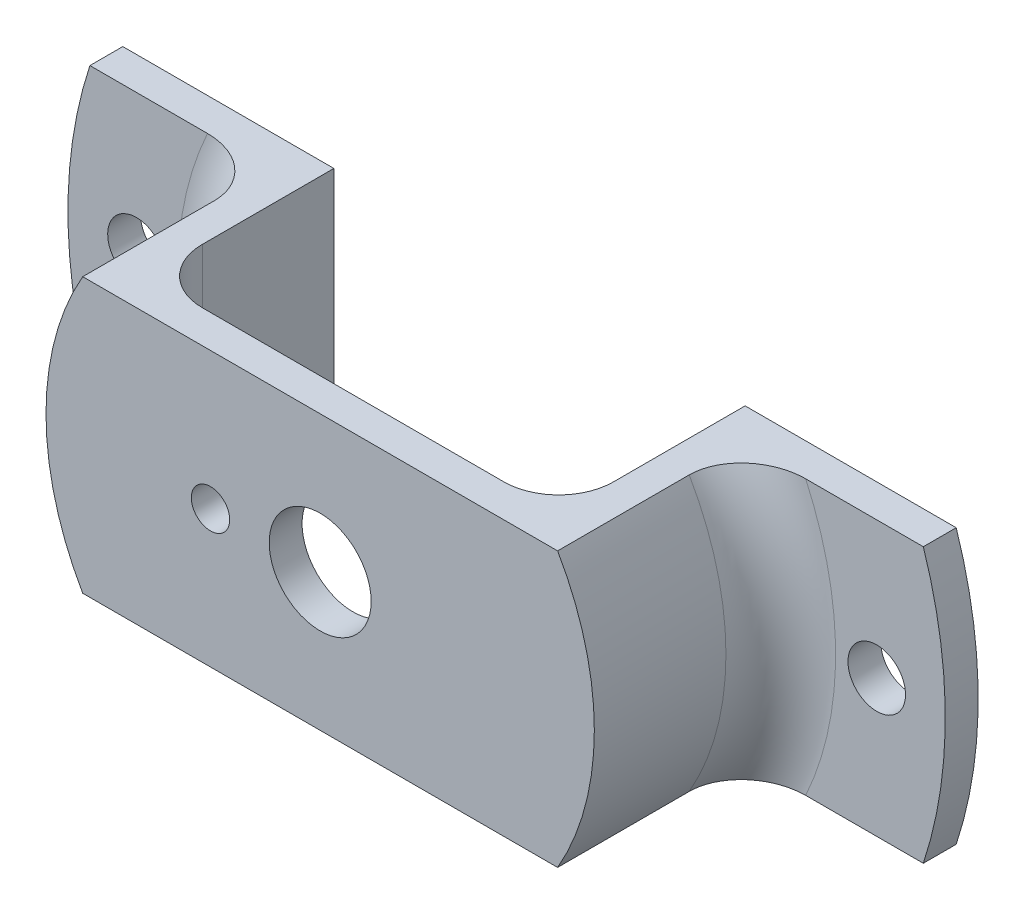
ISO-10303-21;
HEADER;
FILE_DESCRIPTION(('STEP AP214'),'2;1');
FILE_NAME('part.step','',(''),(''),'','','');
FILE_SCHEMA(('AUTOMOTIVE_DESIGN { 1 0 10303 214 1 1 1 1 }'));
ENDSEC;
DATA;
#1=APPLICATION_CONTEXT('core data for automotive mechanical design processes');
#2=APPLICATION_PROTOCOL_DEFINITION('international standard','automotive_design',2000,#1);
#3=PRODUCT_CONTEXT('',#1,'mechanical');
#4=PRODUCT('Part','Part','',(#3));
#5=PRODUCT_RELATED_PRODUCT_CATEGORY('part','',(#4));
#6=PRODUCT_DEFINITION_FORMATION('','',#4);
#7=PRODUCT_DEFINITION_CONTEXT('part definition',#1,'design');
#8=PRODUCT_DEFINITION('design','',#6,#7);
#9=PRODUCT_DEFINITION_SHAPE('','',#8);
#10=(LENGTH_UNIT() NAMED_UNIT(*) SI_UNIT(.MILLI.,.METRE.));
#11=(NAMED_UNIT(*) PLANE_ANGLE_UNIT() SI_UNIT($,.RADIAN.));
#12=(NAMED_UNIT(*) SI_UNIT($,.STERADIAN.) SOLID_ANGLE_UNIT());
#13=UNCERTAINTY_MEASURE_WITH_UNIT(LENGTH_MEASURE(1.E-05),#10,'distance_accuracy_value','');
#14=(GEOMETRIC_REPRESENTATION_CONTEXT(3) GLOBAL_UNCERTAINTY_ASSIGNED_CONTEXT((#13)) GLOBAL_UNIT_ASSIGNED_CONTEXT((#10,
#11,#12)) REPRESENTATION_CONTEXT('',''));
#15=CARTESIAN_POINT('',(0.,0.,0.));
#16=DIRECTION('',(0.,0.,1.));
#17=DIRECTION('',(1.,0.,0.));
#18=AXIS2_PLACEMENT_3D('',#15,#16,#17);
#19=CARTESIAN_POINT('',(-28.75,12.5,3.));
#20=DIRECTION('',(0.,-1.,0.));
#21=DIRECTION('',(0.,0.,-1.));
#22=AXIS2_PLACEMENT_3D('',#19,#20,#21);
#23=PLANE('',#22);
#24=DIRECTION('',(0.,0.,1.));
#25=VECTOR('',#24,1.);
#26=CARTESIAN_POINT('',(21.650635094611,12.5,-14.));
#27=LINE('',#26,#25);
#28=CARTESIAN_POINT('',(21.650635094611,12.5,-9.));
#29=VERTEX_POINT('',#28);
#30=CARTESIAN_POINT('',(21.650635094611,12.5,3.));
#31=VERTEX_POINT('',#30);
#32=EDGE_CURVE('E174',#29,#31,#27,.T.);
#33=ORIENTED_EDGE('',*,*,#32,.F.);
#34=CARTESIAN_POINT('',(21.650635094611,12.5,-9.));
#35=CARTESIAN_POINT('',(21.6506059030067,12.5,-9.12798250689795));
#36=CARTESIAN_POINT('',(21.6563078653461,12.5,-9.25595401343454));
#37=CARTESIAN_POINT('',(21.6789565593302,12.5,-9.51084996998801));
#38=CARTESIAN_POINT('',(21.6958989370696,12.5,-9.63777480616131));
#39=CARTESIAN_POINT('',(21.7407077547514,12.5,-9.88907263980753));
#40=CARTESIAN_POINT('',(21.7685234970425,12.5,-10.0134547010519));
#41=CARTESIAN_POINT('',(21.8346870466424,12.5,-10.2593850225597));
#42=CARTESIAN_POINT('',(21.8730354527897,12.5,-10.3809331212708));
#43=CARTESIAN_POINT('',(21.9597107996309,12.5,-10.6202225204246));
#44=CARTESIAN_POINT('',(22.0080235491501,12.5,-10.7379689623236));
#45=CARTESIAN_POINT('',(22.1140785751362,12.5,-10.9691530925264));
#46=CARTESIAN_POINT('',(22.1718244186283,12.5,-11.0825891308178));
#47=CARTESIAN_POINT('',(22.358351801326,12.5,-11.4155965691329));
#48=CARTESIAN_POINT('',(22.5004253010735,12.5,-11.6278730186201));
#49=CARTESIAN_POINT('',(22.8237429817085,12.5,-12.0406087449315));
#50=CARTESIAN_POINT('',(23.0068057012288,12.5,-12.2396285366201));
#51=CARTESIAN_POINT('',(23.4003559151076,12.5,-12.6083414560239));
#52=CARTESIAN_POINT('',(23.6108517781452,12.5,-12.7780255977871));
#53=CARTESIAN_POINT('',(24.0815290290692,12.5,-13.1054279576477));
#54=CARTESIAN_POINT('',(24.3446294318428,12.5,-13.258952303191));
#55=CARTESIAN_POINT('',(24.8911448780884,12.5,-13.5242176644491));
#56=CARTESIAN_POINT('',(25.1745714924091,12.5,-13.6359346523861));
#57=CARTESIAN_POINT('',(25.7570034949569,12.5,-13.816539975278));
#58=CARTESIAN_POINT('',(26.0561023721819,12.5,-13.8851294131749));
#59=CARTESIAN_POINT('',(26.5095241772153,12.5,-13.9539208081991));
#60=CARTESIAN_POINT('',(26.6614408888955,12.5,-13.9711691196701));
#61=CARTESIAN_POINT('',(26.9661437171469,12.5,-13.994205846964));
#62=CARTESIAN_POINT('',(27.1189298540127,12.5,-13.9999939941664));
#63=CARTESIAN_POINT('',(27.2717802865893,12.5,-14.));
#64=B_SPLINE_CURVE_WITH_KNOTS('',3,(#34,#35,#36,#37,#38,#39,#40,#41,#42,#43,#44,#45,#46,#47,#48,
#49,#50,#51,#52,#53,#54,#55,#56,#57,#58,#59,#60,#61,#62,#63),.UNSPECIFIED.,.F.,.F.,(4,2,2,2,2,2,
2,2,2,2,2,2,2,2,4),(0.,0.383803314361393,0.767458051608951,1.14934491391862,1.53125349304499,
1.9126218696893,2.2941347920174,3.05714254235225,3.86523679254561,4.67357813730067,
5.58365612768365,6.49425636323604,7.41109993235273,7.86940606343011,8.32772293684774),.UNSPECIFIED.);
#65=CARTESIAN_POINT('',(27.2717802865893,12.5,-14.));
#66=VERTEX_POINT('',#65);
#67=EDGE_CURVE('E221',#29,#66,#64,.T.);
#68=ORIENTED_EDGE('',*,*,#67,.T.);
#69=DIRECTION('',(-1.,0.,0.));
#70=VECTOR('',#69,1.);
#71=CARTESIAN_POINT('',(43.75,12.5,-14.));
#72=LINE('',#71,#70);
#73=CARTESIAN_POINT('',(37.9967103839267,12.5,-14.));
#74=VERTEX_POINT('',#73);
#75=EDGE_CURVE('E296',#74,#66,#72,.T.);
#76=ORIENTED_EDGE('',*,*,#75,.F.);
#77=DIRECTION('',(0.,0.,-1.));
#78=VECTOR('',#77,1.);
#79=CARTESIAN_POINT('',(37.9967103839267,12.5,23.));
#80=LINE('',#79,#78);
#81=CARTESIAN_POINT('',(37.9967103839267,12.5,-17.));
#82=VERTEX_POINT('',#81);
#83=EDGE_CURVE('E586',#82,#74,#80,.F.);
#84=ORIENTED_EDGE('',*,*,#83,.F.);
#85=DIRECTION('',(1.,0.,0.));
#86=VECTOR('',#85,1.);
#87=CARTESIAN_POINT('',(28.75,12.5,-17.));
#88=LINE('',#87,#86);
#89=CARTESIAN_POINT('',(18.75,12.5,-17.));
#90=VERTEX_POINT('',#89);
#91=EDGE_CURVE('E310',#90,#82,#88,.T.);
#92=ORIENTED_EDGE('',*,*,#91,.F.);
#93=DIRECTION('',(0.,0.,1.));
#94=VECTOR('',#93,1.);
#95=CARTESIAN_POINT('',(18.75,12.5,-17.));
#96=LINE('',#95,#94);
#97=CARTESIAN_POINT('',(18.75,12.5,-5.));
#98=VERTEX_POINT('',#97);
#99=EDGE_CURVE('E313',#90,#98,#96,.T.);
#100=ORIENTED_EDGE('',*,*,#99,.T.);
#101=CARTESIAN_POINT('',(13.75,12.5,-5.));
#102=DIRECTION('',(0.,-1.,0.));
#103=DIRECTION('',(0.,0.,-1.));
#104=AXIS2_PLACEMENT_3D('',#101,#102,#103);
#105=CIRCLE('',#104,5.);
#106=CARTESIAN_POINT('',(13.75,12.5,0.));
#107=VERTEX_POINT('',#106);
#108=EDGE_CURVE('E279',#98,#107,#105,.T.);
#109=ORIENTED_EDGE('',*,*,#108,.T.);
#110=DIRECTION('',(-1.,0.,0.));
#111=VECTOR('',#110,1.);
#112=CARTESIAN_POINT('',(-28.75,12.5,0.));
#113=LINE('',#112,#111);
#114=CARTESIAN_POINT('',(-13.75,12.5,0.));
#115=VERTEX_POINT('',#114);
#116=EDGE_CURVE('E184',#107,#115,#113,.T.);
#117=ORIENTED_EDGE('',*,*,#116,.T.);
#118=CARTESIAN_POINT('',(-13.75,12.5,-5.));
#119=DIRECTION('',(0.,-1.,0.));
#120=DIRECTION('',(0.,0.,-1.));
#121=AXIS2_PLACEMENT_3D('',#118,#119,#120);
#122=CIRCLE('',#121,5.);
#123=CARTESIAN_POINT('',(-18.75,12.5,-5.));
#124=VERTEX_POINT('',#123);
#125=EDGE_CURVE('E276',#115,#124,#122,.T.);
#126=ORIENTED_EDGE('',*,*,#125,.T.);
#127=DIRECTION('',(0.,0.,1.));
#128=VECTOR('',#127,1.);
#129=CARTESIAN_POINT('',(-18.75,12.5,-17.));
#130=LINE('',#129,#128);
#131=CARTESIAN_POINT('',(-18.75,12.5,-17.));
#132=VERTEX_POINT('',#131);
#133=EDGE_CURVE('E305',#132,#124,#130,.T.);
#134=ORIENTED_EDGE('',*,*,#133,.F.);
#135=DIRECTION('',(-1.,0.,0.));
#136=VECTOR('',#135,1.);
#137=CARTESIAN_POINT('',(-28.75,12.5,-17.));
#138=LINE('',#137,#136);
#139=CARTESIAN_POINT('',(-37.9967103839267,12.5,-17.));
#140=VERTEX_POINT('',#139);
#141=EDGE_CURVE('E554',#132,#140,#138,.T.);
#142=ORIENTED_EDGE('',*,*,#141,.T.);
#143=DIRECTION('',(0.,0.,-1.));
#144=VECTOR('',#143,1.);
#145=CARTESIAN_POINT('',(-37.9967103839267,12.5,23.));
#146=LINE('',#145,#144);
#147=CARTESIAN_POINT('',(-37.9967103839267,12.5,-14.));
#148=VERTEX_POINT('',#147);
#149=EDGE_CURVE('E543',#148,#140,#146,.T.);
#150=ORIENTED_EDGE('',*,*,#149,.F.);
#151=DIRECTION('',(1.,0.,0.));
#152=VECTOR('',#151,1.);
#153=CARTESIAN_POINT('',(-43.75,12.5,-14.));
#154=LINE('',#153,#152);
#155=CARTESIAN_POINT('',(-27.2717802865893,12.5,-14.));
#156=VERTEX_POINT('',#155);
#157=EDGE_CURVE('E564',#148,#156,#154,.T.);
#158=ORIENTED_EDGE('',*,*,#157,.T.);
#159=CARTESIAN_POINT('',(-27.2717802865893,12.5,-14.));
#160=CARTESIAN_POINT('',(-27.1008403135715,12.5,-14.0000064954266));
#161=CARTESIAN_POINT('',(-26.9299098256127,12.5,-13.9927560467699));
#162=CARTESIAN_POINT('',(-26.5892638212925,12.5,-13.9639343262197));
#163=CARTESIAN_POINT('',(-26.419548272564,12.5,-13.9423634372808));
#164=CARTESIAN_POINT('',(-26.0823006751831,12.5,-13.8850568027101));
#165=CARTESIAN_POINT('',(-25.914771738421,12.5,-13.8493027516972));
#166=CARTESIAN_POINT('',(-25.5832491603287,12.5,-13.7638484569576));
#167=CARTESIAN_POINT('',(-25.4192566893746,12.5,-13.7141436703217));
#168=CARTESIAN_POINT('',(-25.0959777541771,12.5,-13.6010216363063));
#169=CARTESIAN_POINT('',(-24.9366936122702,12.5,-13.5375977462888));
#170=CARTESIAN_POINT('',(-24.6241439703862,12.5,-13.3973419374285));
#171=CARTESIAN_POINT('',(-24.4708781769105,12.5,-13.3205106734243));
#172=CARTESIAN_POINT('',(-24.1716373515444,12.5,-13.1537701375692));
#173=CARTESIAN_POINT('',(-24.0256618078814,12.5,-13.0638617854634));
#174=CARTESIAN_POINT('',(-23.7423910545038,12.5,-12.8713899908232));
#175=CARTESIAN_POINT('',(-23.605091715345,12.5,-12.7688326382503));
#176=CARTESIAN_POINT('',(-23.3449217932502,12.5,-12.5551192754945));
#177=CARTESIAN_POINT('',(-23.2217230134192,12.5,-12.4443632354588));
#178=CARTESIAN_POINT('',(-22.9861023629804,12.5,-12.2120195533435));
#179=CARTESIAN_POINT('',(-22.8736748417032,12.5,-12.0904376558869));
#180=CARTESIAN_POINT('',(-22.6609446024159,12.5,-11.8370707323319));
#181=CARTESIAN_POINT('',(-22.5606419279947,12.5,-11.7052856695557));
#182=CARTESIAN_POINT('',(-22.3736377830092,12.5,-11.4323982270188));
#183=CARTESIAN_POINT('',(-22.2869336085411,12.5,-11.291297707477));
#184=CARTESIAN_POINT('',(-22.1375866713774,12.5,-11.0174346322746));
#185=CARTESIAN_POINT('',(-22.073328317441,12.5,-10.8855519597147));
#186=CARTESIAN_POINT('',(-21.9575782575371,12.5,-10.6163074329578));
#187=CARTESIAN_POINT('',(-21.9060840092252,12.5,-10.4789466762188));
#188=CARTESIAN_POINT('',(-21.8168030745833,12.5,-10.2001948878867));
#189=CARTESIAN_POINT('',(-21.7789842636905,12.5,-10.0588141541664));
#190=CARTESIAN_POINT('',(-21.7175763807998,12.5,-9.7730686210699));
#191=CARTESIAN_POINT('',(-21.6939770334161,12.5,-9.62870605466368));
#192=CARTESIAN_POINT('',(-21.6686850846568,12.5,-9.40324537338227));
#193=CARTESIAN_POINT('',(-21.6619158580247,12.5,-9.32268662529211));
#194=CARTESIAN_POINT('',(-21.6528926486093,12.5,-9.16142308590291));
#195=CARTESIAN_POINT('',(-21.6506327391904,12.5,-9.08071862601819));
#196=CARTESIAN_POINT('',(-21.650635094611,12.5,-9.));
#197=B_SPLINE_CURVE_WITH_KNOTS('',3,(#159,#160,#161,#162,#163,#164,#165,#166,#167,#168,#169,
#170,#171,#172,#173,#174,#175,#176,#177,#178,#179,#180,#181,#182,#183,#184,#185,#186,#187,#188,
#189,#190,#191,#192,#193,#194,#195,#196),.UNSPECIFIED.,.F.,.F.,(4,2,2,2,2,2,2,2,2,2,2,2,2,2,2,2,
2,2,4),(0.,0.512653309583715,1.02529291043623,1.53859630931966,2.05206705432881,2.5657869749312,
3.07948181161421,3.59314053628212,4.1065529142697,4.60287165414962,5.09892857980208,
5.59498728872738,6.09094723674575,6.53043713340427,6.96983942234958,7.40820271424702,
7.84624885135592,8.08866403872833,8.33076040725373),.UNSPECIFIED.);
#198=CARTESIAN_POINT('',(-21.650635094611,12.5,-9.));
#199=VERTEX_POINT('',#198);
#200=EDGE_CURVE('E11',#156,#199,#197,.T.);
#201=ORIENTED_EDGE('',*,*,#200,.T.);
#202=DIRECTION('',(0.,0.,1.));
#203=VECTOR('',#202,1.);
#204=CARTESIAN_POINT('',(-21.650635094611,12.5,-14.));
#205=LINE('',#204,#203);
#206=CARTESIAN_POINT('',(-21.650635094611,12.5,3.));
#207=VERTEX_POINT('',#206);
#208=EDGE_CURVE('E159',#207,#199,#205,.F.);
#209=ORIENTED_EDGE('',*,*,#208,.F.);
#210=DIRECTION('',(-1.,0.,0.));
#211=VECTOR('',#210,1.);
#212=CARTESIAN_POINT('',(-28.75,12.5,3.));
#213=LINE('',#212,#211);
#214=EDGE_CURVE('E172',#31,#207,#213,.T.);
#215=ORIENTED_EDGE('',*,*,#214,.F.);
#216=EDGE_LOOP('',(#33,#68,#76,#84,#92,#100,#109,#117,#126,#134,#142,#150,#158,#201,#209,#215));
#217=FACE_BOUND('',#216,.T.);
#218=ADVANCED_FACE('F36',(#217),#23,.F.);
#219=CARTESIAN_POINT('',(-28.75,-12.5,3.));
#220=DIRECTION('',(0.,1.,0.));
#221=DIRECTION('',(0.,0.,1.));
#222=AXIS2_PLACEMENT_3D('',#219,#220,#221);
#223=PLANE('',#222);
#224=DIRECTION('',(0.,0.,1.));
#225=VECTOR('',#224,1.);
#226=CARTESIAN_POINT('',(-21.650635094611,-12.5,-14.));
#227=LINE('',#226,#225);
#228=CARTESIAN_POINT('',(-21.650635094611,-12.5,-9.00000000000001));
#229=VERTEX_POINT('',#228);
#230=CARTESIAN_POINT('',(-21.650635094611,-12.5,3.));
#231=VERTEX_POINT('',#230);
#232=EDGE_CURVE('E161',#229,#231,#227,.T.);
#233=ORIENTED_EDGE('',*,*,#232,.F.);
#234=CARTESIAN_POINT('',(-21.650635094611,-12.5,-9.00000000000001));
#235=CARTESIAN_POINT('',(-21.6506059030067,-12.5,-9.12798250689795));
#236=CARTESIAN_POINT('',(-21.6563078653461,-12.5,-9.25595401343454));
#237=CARTESIAN_POINT('',(-21.6789565593302,-12.5,-9.51084996998801));
#238=CARTESIAN_POINT('',(-21.6958989370696,-12.5,-9.63777480616132));
#239=CARTESIAN_POINT('',(-21.7407077547514,-12.5,-9.88907263980754));
#240=CARTESIAN_POINT('',(-21.7685234970425,-12.5,-10.0134547010519));
#241=CARTESIAN_POINT('',(-21.8346870466424,-12.5,-10.2593850225597));
#242=CARTESIAN_POINT('',(-21.8730354527897,-12.5,-10.3809331212708));
#243=CARTESIAN_POINT('',(-21.9597107996309,-12.5,-10.6202225204246));
#244=CARTESIAN_POINT('',(-22.0080235491501,-12.5,-10.7379689623236));
#245=CARTESIAN_POINT('',(-22.1140785751362,-12.5,-10.9691530925264));
#246=CARTESIAN_POINT('',(-22.1718244186283,-12.5,-11.0825891308178));
#247=CARTESIAN_POINT('',(-22.358351801326,-12.5,-11.4155965691329));
#248=CARTESIAN_POINT('',(-22.5004253010735,-12.5,-11.6278730186201));
#249=CARTESIAN_POINT('',(-22.8237429817085,-12.5,-12.0406087449316));
#250=CARTESIAN_POINT('',(-23.0068057012288,-12.5,-12.2396285366201));
#251=CARTESIAN_POINT('',(-23.4003559151076,-12.5,-12.6083414560239));
#252=CARTESIAN_POINT('',(-23.6108517781452,-12.5,-12.7780255977871));
#253=CARTESIAN_POINT('',(-24.0815290290692,-12.5,-13.1054279576477));
#254=CARTESIAN_POINT('',(-24.3446294318428,-12.5,-13.258952303191));
#255=CARTESIAN_POINT('',(-24.8911448780884,-12.5,-13.5242176644491));
#256=CARTESIAN_POINT('',(-25.1745714924091,-12.5,-13.6359346523861));
#257=CARTESIAN_POINT('',(-25.7570034949569,-12.5,-13.816539975278));
#258=CARTESIAN_POINT('',(-26.0561023721819,-12.5,-13.8851294131749));
#259=CARTESIAN_POINT('',(-26.5095241772153,-12.5,-13.9539208081991));
#260=CARTESIAN_POINT('',(-26.6614408888955,-12.5,-13.9711691196701));
#261=CARTESIAN_POINT('',(-26.9661437171469,-12.5,-13.994205846964));
#262=CARTESIAN_POINT('',(-27.1189298540127,-12.5,-13.9999939941664));
#263=CARTESIAN_POINT('',(-27.2717802865893,-12.5,-14.));
#264=B_SPLINE_CURVE_WITH_KNOTS('',3,(#234,#235,#236,#237,#238,#239,#240,#241,#242,#243,#244,
#245,#246,#247,#248,#249,#250,#251,#252,#253,#254,#255,#256,#257,#258,#259,#260,#261,#262,#263),
.UNSPECIFIED.,.F.,.F.,(4,2,2,2,2,2,2,2,2,2,2,2,2,2,4),(0.,0.383803314361394,0.767458051608952,
1.14934491391862,1.53125349304499,1.9126218696893,2.2941347920174,3.05714254235225,
3.86523679254561,4.67357813730068,5.58365612768365,6.49425636323604,7.41109993235272,
7.86940606343011,8.32772293684774),.UNSPECIFIED.);
#265=CARTESIAN_POINT('',(-27.2717802865893,-12.5,-14.));
#266=VERTEX_POINT('',#265);
#267=EDGE_CURVE('E50',#229,#266,#264,.T.);
#268=ORIENTED_EDGE('',*,*,#267,.T.);
#269=DIRECTION('',(1.,0.,0.));
#270=VECTOR('',#269,1.);
#271=CARTESIAN_POINT('',(-43.75,-12.5,-14.));
#272=LINE('',#271,#270);
#273=CARTESIAN_POINT('',(-37.9967103839267,-12.5,-14.));
#274=VERTEX_POINT('',#273);
#275=EDGE_CURVE('E561',#274,#266,#272,.T.);
#276=ORIENTED_EDGE('',*,*,#275,.F.);
#277=DIRECTION('',(0.,0.,-1.));
#278=VECTOR('',#277,1.);
#279=CARTESIAN_POINT('',(-37.9967103839267,-12.5,23.));
#280=LINE('',#279,#278);
#281=CARTESIAN_POINT('',(-37.9967103839267,-12.5,-17.));
#282=VERTEX_POINT('',#281);
#283=EDGE_CURVE('E548',#282,#274,#280,.F.);
#284=ORIENTED_EDGE('',*,*,#283,.F.);
#285=DIRECTION('',(1.,0.,0.));
#286=VECTOR('',#285,1.);
#287=CARTESIAN_POINT('',(-28.75,-12.5,-17.));
#288=LINE('',#287,#286);
#289=CARTESIAN_POINT('',(-18.75,-12.5,-17.));
#290=VERTEX_POINT('',#289);
#291=EDGE_CURVE('E556',#282,#290,#288,.T.);
#292=ORIENTED_EDGE('',*,*,#291,.T.);
#293=DIRECTION('',(0.,0.,1.));
#294=VECTOR('',#293,1.);
#295=CARTESIAN_POINT('',(-18.75,-12.5,-17.));
#296=LINE('',#295,#294);
#297=CARTESIAN_POINT('',(-18.75,-12.5,-5.));
#298=VERTEX_POINT('',#297);
#299=EDGE_CURVE('E569',#290,#298,#296,.T.);
#300=ORIENTED_EDGE('',*,*,#299,.T.);
#301=CARTESIAN_POINT('',(-13.75,-12.5,-5.));
#302=DIRECTION('',(0.,1.,0.));
#303=DIRECTION('',(0.,0.,1.));
#304=AXIS2_PLACEMENT_3D('',#301,#302,#303);
#305=CIRCLE('',#304,5.);
#306=CARTESIAN_POINT('',(-13.75,-12.5,0.));
#307=VERTEX_POINT('',#306);
#308=EDGE_CURVE('E274',#298,#307,#305,.T.);
#309=ORIENTED_EDGE('',*,*,#308,.T.);
#310=DIRECTION('',(1.,0.,0.));
#311=VECTOR('',#310,1.);
#312=CARTESIAN_POINT('',(-28.75,-12.5,0.));
#313=LINE('',#312,#311);
#314=CARTESIAN_POINT('',(13.75,-12.5,0.));
#315=VERTEX_POINT('',#314);
#316=EDGE_CURVE('E179',#307,#315,#313,.T.);
#317=ORIENTED_EDGE('',*,*,#316,.T.);
#318=CARTESIAN_POINT('',(13.75,-12.5,-5.));
#319=DIRECTION('',(0.,1.,0.));
#320=DIRECTION('',(0.,0.,1.));
#321=AXIS2_PLACEMENT_3D('',#318,#319,#320);
#322=CIRCLE('',#321,5.);
#323=CARTESIAN_POINT('',(18.75,-12.5,-5.));
#324=VERTEX_POINT('',#323);
#325=EDGE_CURVE('E278',#315,#324,#322,.T.);
#326=ORIENTED_EDGE('',*,*,#325,.T.);
#327=DIRECTION('',(0.,0.,1.));
#328=VECTOR('',#327,1.);
#329=CARTESIAN_POINT('',(18.75,-12.5,-17.));
#330=LINE('',#329,#328);
#331=CARTESIAN_POINT('',(18.75,-12.5,-17.));
#332=VERTEX_POINT('',#331);
#333=EDGE_CURVE('E315',#332,#324,#330,.T.);
#334=ORIENTED_EDGE('',*,*,#333,.F.);
#335=DIRECTION('',(-1.,0.,0.));
#336=VECTOR('',#335,1.);
#337=CARTESIAN_POINT('',(28.75,-12.5,-17.));
#338=LINE('',#337,#336);
#339=CARTESIAN_POINT('',(37.9967103839267,-12.5,-17.));
#340=VERTEX_POINT('',#339);
#341=EDGE_CURVE('E301',#340,#332,#338,.T.);
#342=ORIENTED_EDGE('',*,*,#341,.F.);
#343=DIRECTION('',(0.,0.,-1.));
#344=VECTOR('',#343,1.);
#345=CARTESIAN_POINT('',(37.9967103839267,-12.5,23.));
#346=LINE('',#345,#344);
#347=CARTESIAN_POINT('',(37.9967103839267,-12.5,-14.));
#348=VERTEX_POINT('',#347);
#349=EDGE_CURVE('E585',#348,#340,#346,.T.);
#350=ORIENTED_EDGE('',*,*,#349,.F.);
#351=DIRECTION('',(-1.,0.,0.));
#352=VECTOR('',#351,1.);
#353=CARTESIAN_POINT('',(43.75,-12.5,-14.));
#354=LINE('',#353,#352);
#355=CARTESIAN_POINT('',(27.2717802865893,-12.5,-14.));
#356=VERTEX_POINT('',#355);
#357=EDGE_CURVE('E288',#348,#356,#354,.T.);
#358=ORIENTED_EDGE('',*,*,#357,.T.);
#359=CARTESIAN_POINT('',(27.2717802865893,-12.5,-14.));
#360=CARTESIAN_POINT('',(27.1008403135715,-12.5,-14.0000064954266));
#361=CARTESIAN_POINT('',(26.9299098256127,-12.5,-13.9927560467699));
#362=CARTESIAN_POINT('',(26.5892638212925,-12.5,-13.9639343262197));
#363=CARTESIAN_POINT('',(26.419548272564,-12.5,-13.9423634372808));
#364=CARTESIAN_POINT('',(26.0823006751831,-12.5,-13.8850568027101));
#365=CARTESIAN_POINT('',(25.914771738421,-12.5,-13.8493027516972));
#366=CARTESIAN_POINT('',(25.5832491603287,-12.5,-13.7638484569576));
#367=CARTESIAN_POINT('',(25.4192566893746,-12.5,-13.7141436703217));
#368=CARTESIAN_POINT('',(25.0959777541771,-12.5,-13.6010216363063));
#369=CARTESIAN_POINT('',(24.9366936122702,-12.5,-13.5375977462888));
#370=CARTESIAN_POINT('',(24.6241439703862,-12.5,-13.3973419374285));
#371=CARTESIAN_POINT('',(24.4708781769105,-12.5,-13.3205106734243));
#372=CARTESIAN_POINT('',(24.1716373515444,-12.5,-13.1537701375692));
#373=CARTESIAN_POINT('',(24.0256618078814,-12.5,-13.0638617854634));
#374=CARTESIAN_POINT('',(23.7423910545038,-12.5,-12.8713899908232));
#375=CARTESIAN_POINT('',(23.605091715345,-12.5,-12.7688326382503));
#376=CARTESIAN_POINT('',(23.3449217932502,-12.5,-12.5551192754946));
#377=CARTESIAN_POINT('',(23.2217230134192,-12.5,-12.4443632354588));
#378=CARTESIAN_POINT('',(22.9861023629804,-12.5,-12.2120195533435));
#379=CARTESIAN_POINT('',(22.8736748417032,-12.5,-12.0904376558869));
#380=CARTESIAN_POINT('',(22.6609446024159,-12.5,-11.8370707323319));
#381=CARTESIAN_POINT('',(22.5606419279947,-12.5,-11.7052856695558));
#382=CARTESIAN_POINT('',(22.3736377830092,-12.5,-11.4323982270188));
#383=CARTESIAN_POINT('',(22.2869336085411,-12.5,-11.291297707477));
#384=CARTESIAN_POINT('',(22.1375866713774,-12.5,-11.0174346322747));
#385=CARTESIAN_POINT('',(22.073328317441,-12.5,-10.8855519597147));
#386=CARTESIAN_POINT('',(21.9575782575371,-12.5,-10.6163074329578));
#387=CARTESIAN_POINT('',(21.9060840092252,-12.5,-10.4789466762188));
#388=CARTESIAN_POINT('',(21.8168030745833,-12.5,-10.2001948878867));
#389=CARTESIAN_POINT('',(21.7789842636905,-12.5,-10.0588141541664));
#390=CARTESIAN_POINT('',(21.7175763807998,-12.5,-9.7730686210699));
#391=CARTESIAN_POINT('',(21.6939770334161,-12.5,-9.62870605466369));
#392=CARTESIAN_POINT('',(21.6686850846568,-12.5,-9.40324537338227));
#393=CARTESIAN_POINT('',(21.6619158580247,-12.5,-9.32268662529211));
#394=CARTESIAN_POINT('',(21.6528926486093,-12.5,-9.16142308590291));
#395=CARTESIAN_POINT('',(21.6506327391904,-12.5,-9.0807186260182));
#396=CARTESIAN_POINT('',(21.650635094611,-12.5,-9.));
#397=B_SPLINE_CURVE_WITH_KNOTS('',3,(#359,#360,#361,#362,#363,#364,#365,#366,#367,#368,#369,
#370,#371,#372,#373,#374,#375,#376,#377,#378,#379,#380,#381,#382,#383,#384,#385,#386,#387,#388,
#389,#390,#391,#392,#393,#394,#395,#396),.UNSPECIFIED.,.F.,.F.,(4,2,2,2,2,2,2,2,2,2,2,2,2,2,2,2,
2,2,4),(0.,0.512653309583715,1.02529291043623,1.53859630931966,2.05206705432881,2.5657869749312,
3.07948181161421,3.59314053628212,4.10655291426969,4.60287165414962,5.09892857980208,
5.59498728872737,6.09094723674575,6.53043713340427,6.96983942234958,7.40820271424702,
7.84624885135592,8.08866403872833,8.33076040725373),.UNSPECIFIED.);
#398=CARTESIAN_POINT('',(21.650635094611,-12.5,-9.00000000000001));
#399=VERTEX_POINT('',#398);
#400=EDGE_CURVE('E228',#356,#399,#397,.T.);
#401=ORIENTED_EDGE('',*,*,#400,.T.);
#402=DIRECTION('',(0.,0.,1.));
#403=VECTOR('',#402,1.);
#404=CARTESIAN_POINT('',(21.650635094611,-12.5,-14.));
#405=LINE('',#404,#403);
#406=CARTESIAN_POINT('',(21.650635094611,-12.5,3.));
#407=VERTEX_POINT('',#406);
#408=EDGE_CURVE('E166',#407,#399,#405,.F.);
#409=ORIENTED_EDGE('',*,*,#408,.F.);
#410=DIRECTION('',(1.,0.,0.));
#411=VECTOR('',#410,1.);
#412=CARTESIAN_POINT('',(-28.75,-12.5,3.));
#413=LINE('',#412,#411);
#414=EDGE_CURVE('E178',#231,#407,#413,.T.);
#415=ORIENTED_EDGE('',*,*,#414,.F.);
#416=EDGE_LOOP('',(#233,#268,#276,#284,#292,#300,#309,#317,#326,#334,#342,#350,#358,#401,#409,#415));
#417=FACE_BOUND('',#416,.T.);
#418=ADVANCED_FACE('F255',(#417),#223,.F.);
#419=CARTESIAN_POINT('',(0.,0.,3.));
#420=DIRECTION('',(0.,0.,1.));
#421=DIRECTION('',(1.,0.,0.));
#422=AXIS2_PLACEMENT_3D('',#419,#420,#421);
#423=PLANE('',#422);
#424=CARTESIAN_POINT('',(0.,0.,3.));
#425=DIRECTION('',(0.,0.,1.));
#426=DIRECTION('',(1.,0.,0.));
#427=AXIS2_PLACEMENT_3D('',#424,#425,#426);
#428=CIRCLE('',#427,4.65);
#429=CARTESIAN_POINT('',(4.65000000000006,0.,3.));
#430=VERTEX_POINT('',#429);
#431=EDGE_CURVE('E191',#430,#430,#428,.T.);
#432=ORIENTED_EDGE('',*,*,#431,.F.);
#433=EDGE_LOOP('',(#432));
#434=FACE_BOUND('',#433,.T.);
#435=CARTESIAN_POINT('',(-10.,0.,3.));
#436=DIRECTION('',(0.,0.,1.));
#437=DIRECTION('',(1.,0.,0.));
#438=AXIS2_PLACEMENT_3D('',#435,#436,#437);
#439=CIRCLE('',#438,1.75);
#440=CARTESIAN_POINT('',(-8.25,0.,3.));
#441=VERTEX_POINT('',#440);
#442=EDGE_CURVE('E319',#441,#441,#439,.T.);
#443=ORIENTED_EDGE('',*,*,#442,.F.);
#444=EDGE_LOOP('',(#443));
#445=FACE_BOUND('',#444,.T.);
#446=ORIENTED_EDGE('',*,*,#214,.T.);
#447=CARTESIAN_POINT('',(0.,0.,3.));
#448=DIRECTION('',(0.,0.,1.));
#449=DIRECTION('',(1.,0.,0.));
#450=AXIS2_PLACEMENT_3D('',#447,#448,#449);
#451=CIRCLE('',#450,25.);
#452=EDGE_CURVE('E155',#207,#231,#451,.T.);
#453=ORIENTED_EDGE('',*,*,#452,.T.);
#454=ORIENTED_EDGE('',*,*,#414,.T.);
#455=EDGE_CURVE('E167',#407,#31,#451,.T.);
#456=ORIENTED_EDGE('',*,*,#455,.T.);
#457=EDGE_LOOP('',(#446,#453,#454,#456));
#458=FACE_BOUND('',#457,.T.);
#459=ADVANCED_FACE('F177',(#434,#445,#458),#423,.T.);
#460=CARTESIAN_POINT('',(0.,0.,-17.));
#461=DIRECTION('',(0.,0.,-1.));
#462=DIRECTION('',(-1.,0.,0.));
#463=AXIS2_PLACEMENT_3D('',#460,#461,#462);
#464=PLANE('',#463);
#465=CARTESIAN_POINT('',(33.75,0.,-17.));
#466=DIRECTION('',(0.,0.,-1.));
#467=DIRECTION('',(-1.,0.,0.));
#468=AXIS2_PLACEMENT_3D('',#465,#466,#467);
#469=CIRCLE('',#468,2.625);
#470=CARTESIAN_POINT('',(31.125,0.,-17.));
#471=VERTEX_POINT('',#470);
#472=EDGE_CURVE('E203',#471,#471,#469,.T.);
#473=ORIENTED_EDGE('',*,*,#472,.F.);
#474=EDGE_LOOP('',(#473));
#475=FACE_BOUND('',#474,.T.);
#476=ORIENTED_EDGE('',*,*,#91,.T.);
#477=CARTESIAN_POINT('',(0.,0.,-17.));
#478=DIRECTION('',(0.,0.,-1.));
#479=DIRECTION('',(-1.,0.,0.));
#480=AXIS2_PLACEMENT_3D('',#477,#478,#479);
#481=CIRCLE('',#480,40.);
#482=EDGE_CURVE('E557',#82,#340,#481,.T.);
#483=ORIENTED_EDGE('',*,*,#482,.T.);
#484=ORIENTED_EDGE('',*,*,#341,.T.);
#485=DIRECTION('',(0.,1.,0.));
#486=VECTOR('',#485,1.);
#487=CARTESIAN_POINT('',(18.75,12.5,-17.));
#488=LINE('',#487,#486);
#489=EDGE_CURVE('E303',#332,#90,#488,.T.);
#490=ORIENTED_EDGE('',*,*,#489,.T.);
#491=EDGE_LOOP('',(#476,#483,#484,#490));
#492=FACE_BOUND('',#491,.T.);
#493=ADVANCED_FACE('F262',(#475,#492),#464,.T.);
#494=CARTESIAN_POINT('',(43.75,12.5,-14.));
#495=DIRECTION('',(0.,0.,-1.));
#496=DIRECTION('',(0.,1.,0.));
#497=AXIS2_PLACEMENT_3D('',#494,#495,#496);
#498=PLANE('',#497);
#499=CARTESIAN_POINT('',(33.75,0.,-14.));
#500=DIRECTION('',(0.,0.,-1.));
#501=DIRECTION('',(0.,1.,0.));
#502=AXIS2_PLACEMENT_3D('',#499,#500,#501);
#503=CIRCLE('',#502,2.625);
#504=CARTESIAN_POINT('',(33.75,2.625,-14.));
#505=VERTEX_POINT('',#504);
#506=EDGE_CURVE('E200',#505,#505,#503,.T.);
#507=ORIENTED_EDGE('',*,*,#506,.T.);
#508=EDGE_LOOP('',(#507));
#509=FACE_BOUND('',#508,.T.);
#510=ORIENTED_EDGE('',*,*,#75,.T.);
#511=CARTESIAN_POINT('',(0.,0.,-14.));
#512=DIRECTION('',(0.,0.,-1.));
#513=DIRECTION('',(0.,1.,0.));
#514=AXIS2_PLACEMENT_3D('',#511,#512,#513);
#515=CIRCLE('',#514,30.);
#516=EDGE_CURVE('E206',#66,#356,#515,.T.);
#517=ORIENTED_EDGE('',*,*,#516,.T.);
#518=ORIENTED_EDGE('',*,*,#357,.F.);
#519=CARTESIAN_POINT('',(0.,0.,-14.));
#520=DIRECTION('',(0.,0.,-1.));
#521=DIRECTION('',(0.,1.,0.));
#522=AXIS2_PLACEMENT_3D('',#519,#520,#521);
#523=CIRCLE('',#522,40.);
#524=EDGE_CURVE('E300',#74,#348,#523,.T.);
#525=ORIENTED_EDGE('',*,*,#524,.F.);
#526=EDGE_LOOP('',(#510,#517,#518,#525));
#527=FACE_BOUND('',#526,.T.);
#528=ADVANCED_FACE('F299',(#509,#527),#498,.F.);
#529=CARTESIAN_POINT('',(0.,0.,-17.));
#530=DIRECTION('',(0.,0.,-1.));
#531=DIRECTION('',(1.,0.,0.));
#532=AXIS2_PLACEMENT_3D('',#529,#530,#531);
#533=PLANE('',#532);
#534=CARTESIAN_POINT('',(-33.75,0.,-17.));
#535=DIRECTION('',(0.,0.,-1.));
#536=DIRECTION('',(-1.,0.,0.));
#537=AXIS2_PLACEMENT_3D('',#534,#535,#536);
#538=CIRCLE('',#537,2.625);
#539=CARTESIAN_POINT('',(-36.375,0.,-17.));
#540=VERTEX_POINT('',#539);
#541=EDGE_CURVE('E199',#540,#540,#538,.T.);
#542=ORIENTED_EDGE('',*,*,#541,.F.);
#543=EDGE_LOOP('',(#542));
#544=FACE_BOUND('',#543,.T.);
#545=ORIENTED_EDGE('',*,*,#291,.F.);
#546=EDGE_CURVE('E545',#282,#140,#481,.T.);
#547=ORIENTED_EDGE('',*,*,#546,.T.);
#548=ORIENTED_EDGE('',*,*,#141,.F.);
#549=DIRECTION('',(0.,1.,0.));
#550=VECTOR('',#549,1.);
#551=CARTESIAN_POINT('',(-18.75,12.5,-17.));
#552=LINE('',#551,#550);
#553=EDGE_CURVE('E560',#290,#132,#552,.T.);
#554=ORIENTED_EDGE('',*,*,#553,.F.);
#555=EDGE_LOOP('',(#545,#547,#548,#554));
#556=FACE_BOUND('',#555,.T.);
#557=ADVANCED_FACE('F354',(#544,#556),#533,.T.);
#558=CARTESIAN_POINT('',(-43.75,12.5,-14.));
#559=DIRECTION('',(0.,0.,1.));
#560=DIRECTION('',(0.,-1.,0.));
#561=AXIS2_PLACEMENT_3D('',#558,#559,#560);
#562=PLANE('',#561);
#563=CARTESIAN_POINT('',(-33.75,0.,-14.));
#564=DIRECTION('',(0.,0.,1.));
#565=DIRECTION('',(0.,-1.,0.));
#566=AXIS2_PLACEMENT_3D('',#563,#564,#565);
#567=CIRCLE('',#566,2.625);
#568=CARTESIAN_POINT('',(-33.75,-2.625,-14.));
#569=VERTEX_POINT('',#568);
#570=EDGE_CURVE('E196',#569,#569,#567,.T.);
#571=ORIENTED_EDGE('',*,*,#570,.F.);
#572=EDGE_LOOP('',(#571));
#573=FACE_BOUND('',#572,.T.);
#574=ORIENTED_EDGE('',*,*,#275,.T.);
#575=CARTESIAN_POINT('',(0.,0.,-14.));
#576=DIRECTION('',(0.,0.,1.));
#577=DIRECTION('',(0.,-1.,0.));
#578=AXIS2_PLACEMENT_3D('',#575,#576,#577);
#579=CIRCLE('',#578,30.);
#580=EDGE_CURVE('E63',#266,#156,#579,.F.);
#581=ORIENTED_EDGE('',*,*,#580,.T.);
#582=ORIENTED_EDGE('',*,*,#157,.F.);
#583=CARTESIAN_POINT('',(0.,0.,-14.));
#584=DIRECTION('',(0.,0.,1.));
#585=DIRECTION('',(0.,-1.,0.));
#586=AXIS2_PLACEMENT_3D('',#583,#584,#585);
#587=CIRCLE('',#586,40.);
#588=EDGE_CURVE('E181',#148,#274,#587,.T.);
#589=ORIENTED_EDGE('',*,*,#588,.T.);
#590=EDGE_LOOP('',(#574,#581,#582,#589));
#591=FACE_BOUND('',#590,.T.);
#592=ADVANCED_FACE('F342',(#573,#591),#562,.T.);
#593=CARTESIAN_POINT('',(0.,0.,0.));
#594=DIRECTION('',(0.,0.,1.));
#595=DIRECTION('',(1.,0.,0.));
#596=AXIS2_PLACEMENT_3D('',#593,#594,#595);
#597=PLANE('',#596);
#598=CARTESIAN_POINT('',(-10.,0.,0.));
#599=DIRECTION('',(0.,0.,1.));
#600=DIRECTION('',(1.,0.,0.));
#601=AXIS2_PLACEMENT_3D('',#598,#599,#600);
#602=CIRCLE('',#601,1.75);
#603=CARTESIAN_POINT('',(-8.25,0.,0.));
#604=VERTEX_POINT('',#603);
#605=EDGE_CURVE('E318',#604,#604,#602,.T.);
#606=ORIENTED_EDGE('',*,*,#605,.T.);
#607=EDGE_LOOP('',(#606));
#608=FACE_BOUND('',#607,.T.);
#609=CARTESIAN_POINT('',(0.,0.,0.));
#610=DIRECTION('',(0.,0.,1.));
#611=DIRECTION('',(1.,0.,0.));
#612=AXIS2_PLACEMENT_3D('',#609,#610,#611);
#613=CIRCLE('',#612,4.65);
#614=CARTESIAN_POINT('',(4.65000000000006,0.,0.));
#615=VERTEX_POINT('',#614);
#616=EDGE_CURVE('E187',#615,#615,#613,.T.);
#617=ORIENTED_EDGE('',*,*,#616,.T.);
#618=EDGE_LOOP('',(#617));
#619=FACE_BOUND('',#618,.T.);
#620=ORIENTED_EDGE('',*,*,#116,.F.);
#621=DIRECTION('',(0.,1.,0.));
#622=VECTOR('',#621,1.);
#623=CARTESIAN_POINT('',(13.75,-12.5,0.));
#624=LINE('',#623,#622);
#625=EDGE_CURVE('E214',#107,#315,#624,.F.);
#626=ORIENTED_EDGE('',*,*,#625,.T.);
#627=ORIENTED_EDGE('',*,*,#316,.F.);
#628=DIRECTION('',(0.,1.,0.));
#629=VECTOR('',#628,1.);
#630=CARTESIAN_POINT('',(-13.75,0.,0.));
#631=LINE('',#630,#629);
#632=EDGE_CURVE('E211',#307,#115,#631,.T.);
#633=ORIENTED_EDGE('',*,*,#632,.T.);
#634=EDGE_LOOP('',(#620,#626,#627,#633));
#635=FACE_BOUND('',#634,.T.);
#636=ADVANCED_FACE('F267',(#608,#619,#635),#597,.F.);
#637=CARTESIAN_POINT('',(0.,0.,3.));
#638=DIRECTION('',(0.,0.,-1.));
#639=DIRECTION('',(-1.,0.,0.));
#640=AXIS2_PLACEMENT_3D('',#637,#638,#639);
#641=CYLINDRICAL_SURFACE('',#640,4.65);
#642=ORIENTED_EDGE('',*,*,#431,.T.);
#643=EDGE_LOOP('',(#642));
#644=FACE_BOUND('',#643,.T.);
#645=ORIENTED_EDGE('',*,*,#616,.F.);
#646=EDGE_LOOP('',(#645));
#647=FACE_BOUND('',#646,.T.);
#648=ADVANCED_FACE('F331',(#644,#647),#641,.F.);
#649=CARTESIAN_POINT('',(-10.,0.,3.));
#650=DIRECTION('',(0.,0.,-1.));
#651=DIRECTION('',(-1.,0.,0.));
#652=AXIS2_PLACEMENT_3D('',#649,#650,#651);
#653=CYLINDRICAL_SURFACE('',#652,1.75);
#654=ORIENTED_EDGE('',*,*,#442,.T.);
#655=EDGE_LOOP('',(#654));
#656=FACE_BOUND('',#655,.T.);
#657=ORIENTED_EDGE('',*,*,#605,.F.);
#658=EDGE_LOOP('',(#657));
#659=FACE_BOUND('',#658,.T.);
#660=ADVANCED_FACE('F333',(#656,#659),#653,.F.);
#661=CARTESIAN_POINT('',(18.75,12.5,-17.));
#662=DIRECTION('',(1.,0.,0.));
#663=DIRECTION('',(0.,0.,-1.));
#664=AXIS2_PLACEMENT_3D('',#661,#662,#663);
#665=PLANE('',#664);
#666=ORIENTED_EDGE('',*,*,#333,.T.);
#667=DIRECTION('',(0.,1.,0.));
#668=VECTOR('',#667,1.);
#669=CARTESIAN_POINT('',(18.75,12.5,-5.));
#670=LINE('',#669,#668);
#671=EDGE_CURVE('E208',#324,#98,#670,.T.);
#672=ORIENTED_EDGE('',*,*,#671,.T.);
#673=ORIENTED_EDGE('',*,*,#99,.F.);
#674=ORIENTED_EDGE('',*,*,#489,.F.);
#675=EDGE_LOOP('',(#666,#672,#673,#674));
#676=FACE_BOUND('',#675,.T.);
#677=ADVANCED_FACE('F339',(#676),#665,.F.);
#678=CARTESIAN_POINT('',(-18.75,12.5,-17.));
#679=DIRECTION('',(1.,0.,0.));
#680=DIRECTION('',(0.,0.,-1.));
#681=AXIS2_PLACEMENT_3D('',#678,#679,#680);
#682=PLANE('',#681);
#683=ORIENTED_EDGE('',*,*,#133,.T.);
#684=DIRECTION('',(0.,1.,0.));
#685=VECTOR('',#684,1.);
#686=CARTESIAN_POINT('',(-18.75,12.5,-5.));
#687=LINE('',#686,#685);
#688=EDGE_CURVE('E216',#124,#298,#687,.F.);
#689=ORIENTED_EDGE('',*,*,#688,.T.);
#690=ORIENTED_EDGE('',*,*,#299,.F.);
#691=ORIENTED_EDGE('',*,*,#553,.T.);
#692=EDGE_LOOP('',(#683,#689,#690,#691));
#693=FACE_BOUND('',#692,.T.);
#694=ADVANCED_FACE('F347',(#693),#682,.T.);
#695=CARTESIAN_POINT('',(0.,0.,23.));
#696=DIRECTION('',(0.,0.,-1.));
#697=DIRECTION('',(-1.,0.,0.));
#698=AXIS2_PLACEMENT_3D('',#695,#696,#697);
#699=CYLINDRICAL_SURFACE('',#698,40.);
#700=ORIENTED_EDGE('',*,*,#149,.T.);
#701=ORIENTED_EDGE('',*,*,#546,.F.);
#702=ORIENTED_EDGE('',*,*,#283,.T.);
#703=ORIENTED_EDGE('',*,*,#588,.F.);
#704=EDGE_LOOP('',(#700,#701,#702,#703));
#705=FACE_BOUND('',#704,.T.);
#706=ADVANCED_FACE('F358',(#705),#699,.T.);
#707=ORIENTED_EDGE('',*,*,#83,.T.);
#708=ORIENTED_EDGE('',*,*,#524,.T.);
#709=ORIENTED_EDGE('',*,*,#349,.T.);
#710=ORIENTED_EDGE('',*,*,#482,.F.);
#711=EDGE_LOOP('',(#707,#708,#709,#710));
#712=FACE_BOUND('',#711,.T.);
#713=ADVANCED_FACE('F366',(#712),#699,.T.);
#714=CARTESIAN_POINT('',(-33.75,0.,-19.));
#715=DIRECTION('',(0.,0.,1.));
#716=DIRECTION('',(1.,0.,0.));
#717=AXIS2_PLACEMENT_3D('',#714,#715,#716);
#718=CYLINDRICAL_SURFACE('',#717,2.625);
#719=ORIENTED_EDGE('',*,*,#541,.T.);
#720=EDGE_LOOP('',(#719));
#721=FACE_BOUND('',#720,.T.);
#722=ORIENTED_EDGE('',*,*,#570,.T.);
#723=EDGE_LOOP('',(#722));
#724=FACE_BOUND('',#723,.T.);
#725=ADVANCED_FACE('F369',(#721,#724),#718,.F.);
#726=CARTESIAN_POINT('',(33.75,0.,-19.));
#727=DIRECTION('',(0.,0.,1.));
#728=DIRECTION('',(1.,0.,0.));
#729=AXIS2_PLACEMENT_3D('',#726,#727,#728);
#730=CYLINDRICAL_SURFACE('',#729,2.625);
#731=ORIENTED_EDGE('',*,*,#472,.T.);
#732=EDGE_LOOP('',(#731));
#733=FACE_BOUND('',#732,.T.);
#734=ORIENTED_EDGE('',*,*,#506,.F.);
#735=EDGE_LOOP('',(#734));
#736=FACE_BOUND('',#735,.T.);
#737=ADVANCED_FACE('F371',(#733,#736),#730,.F.);
#738=CARTESIAN_POINT('',(0.,0.,-14.));
#739=DIRECTION('',(0.,0.,1.));
#740=DIRECTION('',(1.,0.,0.));
#741=AXIS2_PLACEMENT_3D('',#738,#739,#740);
#742=CYLINDRICAL_SURFACE('',#741,25.);
#743=ORIENTED_EDGE('',*,*,#208,.T.);
#744=CARTESIAN_POINT('',(0.,0.,-9.));
#745=DIRECTION('',(0.,0.,1.));
#746=DIRECTION('',(0.,-1.,0.));
#747=AXIS2_PLACEMENT_3D('',#744,#745,#746);
#748=CIRCLE('',#747,25.);
#749=EDGE_CURVE('E218',#199,#229,#748,.T.);
#750=ORIENTED_EDGE('',*,*,#749,.T.);
#751=ORIENTED_EDGE('',*,*,#232,.T.);
#752=ORIENTED_EDGE('',*,*,#452,.F.);
#753=EDGE_LOOP('',(#743,#750,#751,#752));
#754=FACE_BOUND('',#753,.T.);
#755=ADVANCED_FACE('F157',(#754),#742,.T.);
#756=ORIENTED_EDGE('',*,*,#408,.T.);
#757=CARTESIAN_POINT('',(0.,0.,-9.));
#758=DIRECTION('',(0.,0.,-1.));
#759=DIRECTION('',(0.,1.,0.));
#760=AXIS2_PLACEMENT_3D('',#757,#758,#759);
#761=CIRCLE('',#760,25.);
#762=EDGE_CURVE('E195',#399,#29,#761,.F.);
#763=ORIENTED_EDGE('',*,*,#762,.T.);
#764=ORIENTED_EDGE('',*,*,#32,.T.);
#765=ORIENTED_EDGE('',*,*,#455,.F.);
#766=EDGE_LOOP('',(#756,#763,#764,#765));
#767=FACE_BOUND('',#766,.T.);
#768=ADVANCED_FACE('F241',(#767),#742,.T.);
#769=CARTESIAN_POINT('',(0.,0.,-9.));
#770=DIRECTION('',(0.,0.,-1.));
#771=DIRECTION('',(0.,1.,0.));
#772=AXIS2_PLACEMENT_3D('',#769,#770,#771);
#773=TOROIDAL_SURFACE('',#772,30.,5.);
#774=ORIENTED_EDGE('',*,*,#400,.F.);
#775=ORIENTED_EDGE('',*,*,#516,.F.);
#776=ORIENTED_EDGE('',*,*,#67,.F.);
#777=ORIENTED_EDGE('',*,*,#762,.F.);
#778=EDGE_LOOP('',(#774,#775,#776,#777));
#779=FACE_BOUND('',#778,.T.);
#780=ADVANCED_FACE('F236',(#779),#773,.F.);
#781=CARTESIAN_POINT('',(13.75,12.5,-5.));
#782=DIRECTION('',(0.,-1.,0.));
#783=DIRECTION('',(0.,0.,-1.));
#784=AXIS2_PLACEMENT_3D('',#781,#782,#783);
#785=CYLINDRICAL_SURFACE('',#784,5.);
#786=ORIENTED_EDGE('',*,*,#325,.F.);
#787=ORIENTED_EDGE('',*,*,#625,.F.);
#788=ORIENTED_EDGE('',*,*,#108,.F.);
#789=ORIENTED_EDGE('',*,*,#671,.F.);
#790=EDGE_LOOP('',(#786,#787,#788,#789));
#791=FACE_BOUND('',#790,.T.);
#792=ADVANCED_FACE('F240',(#791),#785,.F.);
#793=CARTESIAN_POINT('',(-13.75,0.,-5.));
#794=DIRECTION('',(0.,1.,0.));
#795=DIRECTION('',(0.,0.,1.));
#796=AXIS2_PLACEMENT_3D('',#793,#794,#795);
#797=CYLINDRICAL_SURFACE('',#796,5.);
#798=ORIENTED_EDGE('',*,*,#308,.F.);
#799=ORIENTED_EDGE('',*,*,#688,.F.);
#800=ORIENTED_EDGE('',*,*,#125,.F.);
#801=ORIENTED_EDGE('',*,*,#632,.F.);
#802=EDGE_LOOP('',(#798,#799,#800,#801));
#803=FACE_BOUND('',#802,.T.);
#804=ADVANCED_FACE('F245',(#803),#797,.F.);
#805=CARTESIAN_POINT('',(0.,0.,-9.));
#806=DIRECTION('',(0.,0.,1.));
#807=DIRECTION('',(0.,-1.,0.));
#808=AXIS2_PLACEMENT_3D('',#805,#806,#807);
#809=TOROIDAL_SURFACE('',#808,30.,5.);
#810=ORIENTED_EDGE('',*,*,#200,.F.);
#811=ORIENTED_EDGE('',*,*,#580,.F.);
#812=ORIENTED_EDGE('',*,*,#267,.F.);
#813=ORIENTED_EDGE('',*,*,#749,.F.);
#814=EDGE_LOOP('',(#810,#811,#812,#813));
#815=FACE_BOUND('',#814,.T.);
#816=ADVANCED_FACE('F38',(#815),#809,.F.);
#817=CLOSED_SHELL('',(#218,#418,#459,#493,#528,#557,#592,#636,#648,#660,#677,#694,#706,#713,
#725,#737,#755,#768,#780,#792,#804,#816));
#818=MANIFOLD_SOLID_BREP('B2',#817);
#819=ADVANCED_BREP_SHAPE_REPRESENTATION('',(#18,#818),#14);
#820=SHAPE_DEFINITION_REPRESENTATION(#9,#819);
ENDSEC;
END-ISO-10303-21;
